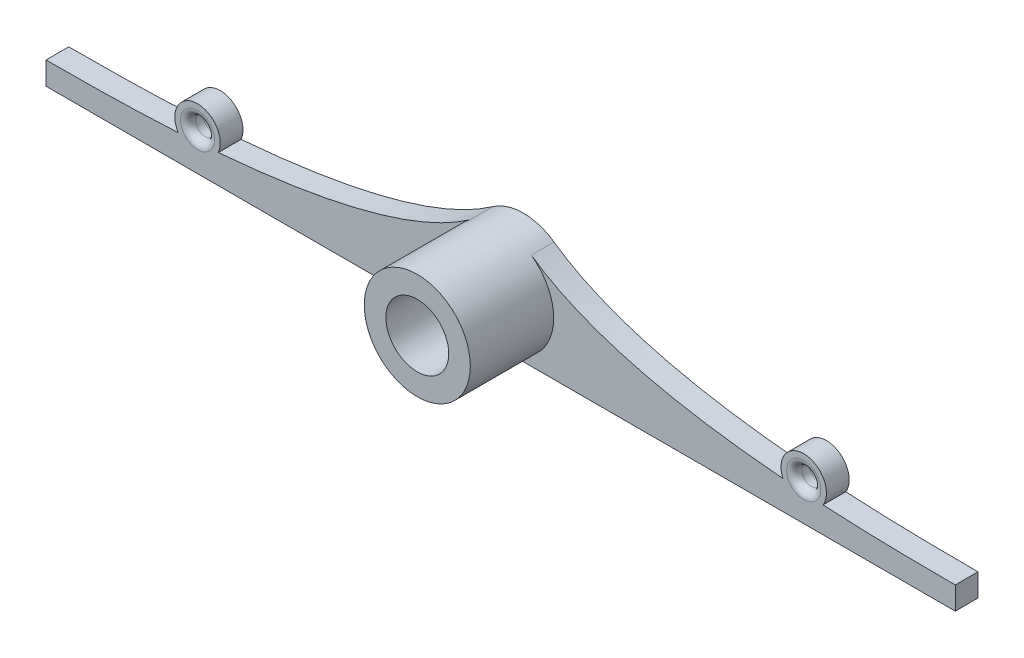
ISO-10303-21;
HEADER;
FILE_DESCRIPTION(('STEP AP214'),'2;1');
FILE_NAME('part.step','',(''),(''),'','','');
FILE_SCHEMA(('AUTOMOTIVE_DESIGN { 1 0 10303 214 1 1 1 1 }'));
ENDSEC;
DATA;
#1=APPLICATION_CONTEXT('core data for automotive mechanical design processes');
#2=APPLICATION_PROTOCOL_DEFINITION('international standard','automotive_design',2000,#1);
#3=PRODUCT_CONTEXT('',#1,'mechanical');
#4=PRODUCT('Part','Part','',(#3));
#5=PRODUCT_RELATED_PRODUCT_CATEGORY('part','',(#4));
#6=PRODUCT_DEFINITION_FORMATION('','',#4);
#7=PRODUCT_DEFINITION_CONTEXT('part definition',#1,'design');
#8=PRODUCT_DEFINITION('design','',#6,#7);
#9=PRODUCT_DEFINITION_SHAPE('','',#8);
#10=(LENGTH_UNIT() NAMED_UNIT(*) SI_UNIT(.MILLI.,.METRE.));
#11=(NAMED_UNIT(*) PLANE_ANGLE_UNIT() SI_UNIT($,.RADIAN.));
#12=(NAMED_UNIT(*) SI_UNIT($,.STERADIAN.) SOLID_ANGLE_UNIT());
#13=UNCERTAINTY_MEASURE_WITH_UNIT(LENGTH_MEASURE(1.E-05),#10,'distance_accuracy_value','');
#14=(GEOMETRIC_REPRESENTATION_CONTEXT(3) GLOBAL_UNCERTAINTY_ASSIGNED_CONTEXT((#13)) GLOBAL_UNIT_ASSIGNED_CONTEXT((#10,
#11,#12)) REPRESENTATION_CONTEXT('',''));
#15=CARTESIAN_POINT('',(0.,0.,0.));
#16=DIRECTION('',(0.,0.,1.));
#17=DIRECTION('',(1.,0.,0.));
#18=AXIS2_PLACEMENT_3D('',#15,#16,#17);
#19=CARTESIAN_POINT('',(-60.,-4.,3.));
#20=CARTESIAN_POINT('',(-44.8110230062299,-4.,3.));
#21=CARTESIAN_POINT('',(-17.0644180254731,-3.48359706406098,3.));
#22=CARTESIAN_POINT('',(-4.03865522459029,5.71745257758117,3.));
#23=B_SPLINE_CURVE_WITH_KNOTS('',3,(#19,#20,#21,#22),.UNSPECIFIED.,.F.,.F.,(4,4),(0.,1.),.UNSPECIFIED.);
#24=DIRECTION('',(0.,0.,-1.));
#25=VECTOR('',#24,1.);
#26=SURFACE_OF_LINEAR_EXTRUSION('',#23,#25);
#27=CARTESIAN_POINT('',(-60.,-4.,0.));
#28=CARTESIAN_POINT('',(-44.8110230062299,-4.,0.));
#29=CARTESIAN_POINT('',(-17.0644180254731,-3.48359706406098,0.));
#30=CARTESIAN_POINT('',(-4.03865522459029,5.71745257758117,0.));
#31=B_SPLINE_CURVE_WITH_KNOTS('',3,(#27,#28,#29,#30),.UNSPECIFIED.,.F.,.F.,(4,4),(0.,1.),.UNSPECIFIED.);
#32=CARTESIAN_POINT('',(-37.2547066708696,-3.20969605150733,0.));
#33=VERTEX_POINT('',#32);
#34=CARTESIAN_POINT('',(-4.03865522459029,5.71745257758117,0.));
#35=VERTEX_POINT('',#34);
#36=EDGE_CURVE('E238',#33,#35,#31,.T.);
#37=ORIENTED_EDGE('',*,*,#36,.F.);
#38=DIRECTION('',(0.,0.,-1.));
#39=VECTOR('',#38,1.);
#40=CARTESIAN_POINT('',(-37.2547066708696,-3.20969605150733,3.));
#41=LINE('',#40,#39);
#42=CARTESIAN_POINT('',(-37.2547066708696,-3.20969605150733,3.));
#43=VERTEX_POINT('',#42);
#44=EDGE_CURVE('E153',#43,#33,#41,.T.);
#45=ORIENTED_EDGE('',*,*,#44,.F.);
#46=CARTESIAN_POINT('',(-4.03865522459029,5.71745257758117,3.));
#47=VERTEX_POINT('',#46);
#48=EDGE_CURVE('E242',#43,#47,#23,.T.);
#49=ORIENTED_EDGE('',*,*,#48,.T.);
#50=DIRECTION('',(0.,0.,-1.));
#51=VECTOR('',#50,1.);
#52=CARTESIAN_POINT('',(-4.03865522459029,5.71745257758117,3.));
#53=LINE('',#52,#51);
#54=EDGE_CURVE('E342',#47,#35,#53,.T.);
#55=ORIENTED_EDGE('',*,*,#54,.T.);
#56=EDGE_LOOP('',(#37,#45,#49,#55));
#57=FACE_BOUND('',#56,.T.);
#58=ADVANCED_FACE('F102',(#57),#26,.T.);
#59=CARTESIAN_POINT('',(-40.,-2.,3.));
#60=DIRECTION('',(0.,0.,-1.));
#61=DIRECTION('',(-1.,0.,0.));
#62=AXIS2_PLACEMENT_3D('',#59,#60,#61);
#63=CYLINDRICAL_SURFACE('',#62,3.);
#64=CARTESIAN_POINT('',(-40.,-2.,0.));
#65=DIRECTION('',(0.,0.,1.));
#66=DIRECTION('',(1.,0.,0.));
#67=AXIS2_PLACEMENT_3D('',#64,#65,#66);
#68=CIRCLE('',#67,3.);
#69=CARTESIAN_POINT('',(-42.550732883701,-3.57916489196225,0.));
#70=VERTEX_POINT('',#69);
#71=EDGE_CURVE('E348',#33,#70,#68,.T.);
#72=ORIENTED_EDGE('',*,*,#71,.T.);
#73=DIRECTION('',(0.,0.,-1.));
#74=VECTOR('',#73,1.);
#75=CARTESIAN_POINT('',(-42.550732883701,-3.57916489196225,3.));
#76=LINE('',#75,#74);
#77=CARTESIAN_POINT('',(-42.550732883701,-3.57916489196225,3.));
#78=VERTEX_POINT('',#77);
#79=EDGE_CURVE('E379',#78,#70,#76,.T.);
#80=ORIENTED_EDGE('',*,*,#79,.F.);
#81=CARTESIAN_POINT('',(-40.,-2.,3.));
#82=DIRECTION('',(0.,0.,1.));
#83=DIRECTION('',(1.,0.,0.));
#84=AXIS2_PLACEMENT_3D('',#81,#82,#83);
#85=CIRCLE('',#84,3.);
#86=EDGE_CURVE('E248',#43,#78,#85,.T.);
#87=ORIENTED_EDGE('',*,*,#86,.F.);
#88=ORIENTED_EDGE('',*,*,#44,.T.);
#89=EDGE_LOOP('',(#72,#80,#87,#88));
#90=FACE_BOUND('',#89,.T.);
#91=ADVANCED_FACE('F258',(#90),#63,.T.);
#92=CARTESIAN_POINT('',(-60.,-4.,3.));
#93=CARTESIAN_POINT('',(-44.8110230062299,-4.,3.));
#94=CARTESIAN_POINT('',(-17.0644180254731,-3.48359706406098,3.));
#95=CARTESIAN_POINT('',(-4.03865522459029,5.71745257758117,3.));
#96=B_SPLINE_CURVE_WITH_KNOTS('',3,(#92,#93,#94,#95),.UNSPECIFIED.,.F.,.F.,(4,4),(0.,1.),.UNSPECIFIED.);
#97=DIRECTION('',(0.,0.,-1.));
#98=VECTOR('',#97,1.);
#99=SURFACE_OF_LINEAR_EXTRUSION('',#96,#98);
#100=CARTESIAN_POINT('',(-60.,-4.,0.));
#101=CARTESIAN_POINT('',(-44.8110230062299,-4.,0.));
#102=CARTESIAN_POINT('',(-17.0644180254731,-3.48359706406098,0.));
#103=CARTESIAN_POINT('',(-4.03865522459029,5.71745257758117,0.));
#104=B_SPLINE_CURVE_WITH_KNOTS('',3,(#100,#101,#102,#103),.UNSPECIFIED.,.F.,.F.,(4,4),(0.,1.),.UNSPECIFIED.);
#105=CARTESIAN_POINT('',(-60.,-4.,0.));
#106=VERTEX_POINT('',#105);
#107=EDGE_CURVE('E355',#106,#70,#104,.T.);
#108=ORIENTED_EDGE('',*,*,#107,.F.);
#109=DIRECTION('',(0.,0.,-1.));
#110=VECTOR('',#109,1.);
#111=CARTESIAN_POINT('',(-60.,-4.,3.));
#112=LINE('',#111,#110);
#113=CARTESIAN_POINT('',(-60.,-4.,3.));
#114=VERTEX_POINT('',#113);
#115=EDGE_CURVE('E376',#114,#106,#112,.T.);
#116=ORIENTED_EDGE('',*,*,#115,.F.);
#117=EDGE_CURVE('E323',#114,#78,#96,.T.);
#118=ORIENTED_EDGE('',*,*,#117,.T.);
#119=ORIENTED_EDGE('',*,*,#79,.T.);
#120=EDGE_LOOP('',(#108,#116,#118,#119));
#121=FACE_BOUND('',#120,.T.);
#122=ADVANCED_FACE('F320',(#121),#99,.T.);
#123=CARTESIAN_POINT('',(-60.,0.,3.));
#124=DIRECTION('',(-1.,0.,0.));
#125=DIRECTION('',(0.,0.,1.));
#126=AXIS2_PLACEMENT_3D('',#123,#124,#125);
#127=PLANE('',#126);
#128=DIRECTION('',(0.,1.,0.));
#129=VECTOR('',#128,1.);
#130=CARTESIAN_POINT('',(-60.,0.,0.));
#131=LINE('',#130,#129);
#132=CARTESIAN_POINT('',(-60.,-7.,0.));
#133=VERTEX_POINT('',#132);
#134=EDGE_CURVE('E361',#133,#106,#131,.T.);
#135=ORIENTED_EDGE('',*,*,#134,.F.);
#136=DIRECTION('',(0.,0.,-1.));
#137=VECTOR('',#136,1.);
#138=CARTESIAN_POINT('',(-60.,-7.,3.));
#139=LINE('',#138,#137);
#140=CARTESIAN_POINT('',(-60.,-7.,3.));
#141=VERTEX_POINT('',#140);
#142=EDGE_CURVE('E127',#141,#133,#139,.T.);
#143=ORIENTED_EDGE('',*,*,#142,.F.);
#144=DIRECTION('',(0.,1.,0.));
#145=VECTOR('',#144,1.);
#146=CARTESIAN_POINT('',(-60.,0.,3.));
#147=LINE('',#146,#145);
#148=EDGE_CURVE('E330',#141,#114,#147,.T.);
#149=ORIENTED_EDGE('',*,*,#148,.T.);
#150=ORIENTED_EDGE('',*,*,#115,.T.);
#151=EDGE_LOOP('',(#135,#143,#149,#150));
#152=FACE_BOUND('',#151,.T.);
#153=ADVANCED_FACE('F315',(#152),#127,.T.);
#154=CARTESIAN_POINT('',(0.,-7.,3.));
#155=DIRECTION('',(0.,-1.,0.));
#156=DIRECTION('',(0.,0.,-1.));
#157=AXIS2_PLACEMENT_3D('',#154,#155,#156);
#158=PLANE('',#157);
#159=DIRECTION('',(-1.,0.,0.));
#160=VECTOR('',#159,1.);
#161=CARTESIAN_POINT('',(0.,-7.,0.));
#162=LINE('',#161,#160);
#163=CARTESIAN_POINT('',(60.,-7.,0.));
#164=VERTEX_POINT('',#163);
#165=EDGE_CURVE('E249',#164,#133,#162,.T.);
#166=ORIENTED_EDGE('',*,*,#165,.F.);
#167=DIRECTION('',(0.,0.,-1.));
#168=VECTOR('',#167,1.);
#169=CARTESIAN_POINT('',(60.,-7.,3.));
#170=LINE('',#169,#168);
#171=CARTESIAN_POINT('',(60.,-7.,3.));
#172=VERTEX_POINT('',#171);
#173=EDGE_CURVE('E643',#172,#164,#170,.T.);
#174=ORIENTED_EDGE('',*,*,#173,.F.);
#175=DIRECTION('',(-1.,0.,0.));
#176=VECTOR('',#175,1.);
#177=CARTESIAN_POINT('',(0.,-7.,3.));
#178=LINE('',#177,#176);
#179=CARTESIAN_POINT('',(0.,-7.,3.));
#180=VERTEX_POINT('',#179);
#181=EDGE_CURVE('E673',#172,#180,#178,.T.);
#182=ORIENTED_EDGE('',*,*,#181,.T.);
#183=DIRECTION('',(-1.,0.,0.));
#184=VECTOR('',#183,1.);
#185=CARTESIAN_POINT('',(0.,-7.,3.));
#186=LINE('',#185,#184);
#187=EDGE_CURVE('E336',#180,#141,#186,.T.);
#188=ORIENTED_EDGE('',*,*,#187,.T.);
#189=ORIENTED_EDGE('',*,*,#142,.T.);
#190=EDGE_LOOP('',(#166,#174,#182,#188,#189));
#191=FACE_BOUND('',#190,.T.);
#192=ADVANCED_FACE('F303',(#191),#158,.T.);
#193=CARTESIAN_POINT('',(-40.,-2.,3.));
#194=DIRECTION('',(0.,0.,-1.));
#195=DIRECTION('',(-1.,0.,0.));
#196=AXIS2_PLACEMENT_3D('',#193,#194,#195);
#197=CYLINDRICAL_SURFACE('',#196,1.25);
#198=CARTESIAN_POINT('',(-40.,-2.,1.));
#199=DIRECTION('',(0.,0.,1.));
#200=DIRECTION('',(1.,0.,0.));
#201=AXIS2_PLACEMENT_3D('',#198,#199,#200);
#202=CIRCLE('',#201,1.25);
#203=CARTESIAN_POINT('',(-38.75,-2.,1.));
#204=VERTEX_POINT('',#203);
#205=EDGE_CURVE('E111',#204,#204,#202,.F.);
#206=ORIENTED_EDGE('',*,*,#205,.T.);
#207=EDGE_LOOP('',(#206));
#208=FACE_BOUND('',#207,.T.);
#209=CARTESIAN_POINT('',(-40.,-2.,2.));
#210=DIRECTION('',(0.,0.,1.));
#211=DIRECTION('',(1.,0.,0.));
#212=AXIS2_PLACEMENT_3D('',#209,#210,#211);
#213=CIRCLE('',#212,1.25);
#214=CARTESIAN_POINT('',(-38.75,-2.,2.));
#215=VERTEX_POINT('',#214);
#216=EDGE_CURVE('E288',#215,#215,#213,.T.);
#217=ORIENTED_EDGE('',*,*,#216,.T.);
#218=EDGE_LOOP('',(#217));
#219=FACE_BOUND('',#218,.T.);
#220=ADVANCED_FACE('F299',(#208,#219),#197,.F.);
#221=CARTESIAN_POINT('',(0.,0.,3.));
#222=DIRECTION('',(0.,0.,1.));
#223=DIRECTION('',(1.,0.,0.));
#224=AXIS2_PLACEMENT_3D('',#221,#222,#223);
#225=PLANE('',#224);
#226=CARTESIAN_POINT('',(-40.,-2.,3.));
#227=DIRECTION('',(0.,0.,1.));
#228=DIRECTION('',(1.,0.,0.));
#229=AXIS2_PLACEMENT_3D('',#226,#227,#228);
#230=CIRCLE('',#229,2.25);
#231=CARTESIAN_POINT('',(-37.75,-2.,3.));
#232=VERTEX_POINT('',#231);
#233=EDGE_CURVE('E12',#232,#232,#230,.F.);
#234=ORIENTED_EDGE('',*,*,#233,.T.);
#235=EDGE_LOOP('',(#234));
#236=FACE_BOUND('',#235,.T.);
#237=ORIENTED_EDGE('',*,*,#48,.F.);
#238=ORIENTED_EDGE('',*,*,#86,.T.);
#239=ORIENTED_EDGE('',*,*,#117,.F.);
#240=ORIENTED_EDGE('',*,*,#148,.F.);
#241=ORIENTED_EDGE('',*,*,#187,.F.);
#242=CARTESIAN_POINT('',(0.,0.,3.));
#243=DIRECTION('',(0.,0.,1.));
#244=DIRECTION('',(1.,0.,0.));
#245=AXIS2_PLACEMENT_3D('',#242,#243,#244);
#246=CIRCLE('',#245,7.);
#247=EDGE_CURVE('E339',#47,#180,#246,.T.);
#248=ORIENTED_EDGE('',*,*,#247,.F.);
#249=EDGE_LOOP('',(#237,#238,#239,#240,#241,#248));
#250=FACE_BOUND('',#249,.T.);
#251=ADVANCED_FACE('F302',(#236,#250),#225,.T.);
#252=CARTESIAN_POINT('',(0.,0.,0.));
#253=DIRECTION('',(0.,0.,1.));
#254=DIRECTION('',(1.,0.,0.));
#255=AXIS2_PLACEMENT_3D('',#252,#253,#254);
#256=PLANE('',#255);
#257=CARTESIAN_POINT('',(40.,-2.,0.));
#258=DIRECTION('',(0.,0.,1.));
#259=DIRECTION('',(1.,0.,0.));
#260=AXIS2_PLACEMENT_3D('',#257,#258,#259);
#261=CIRCLE('',#260,2.25);
#262=CARTESIAN_POINT('',(42.25,-2.,0.));
#263=VERTEX_POINT('',#262);
#264=EDGE_CURVE('E282',#263,#263,#261,.T.);
#265=ORIENTED_EDGE('',*,*,#264,.T.);
#266=EDGE_LOOP('',(#265));
#267=FACE_BOUND('',#266,.T.);
#268=CARTESIAN_POINT('',(-40.,-2.,0.));
#269=DIRECTION('',(0.,0.,1.));
#270=DIRECTION('',(1.,0.,0.));
#271=AXIS2_PLACEMENT_3D('',#268,#269,#270);
#272=CIRCLE('',#271,2.25);
#273=CARTESIAN_POINT('',(-37.75,-2.,0.));
#274=VERTEX_POINT('',#273);
#275=EDGE_CURVE('E279',#274,#274,#272,.T.);
#276=ORIENTED_EDGE('',*,*,#275,.T.);
#277=EDGE_LOOP('',(#276));
#278=FACE_BOUND('',#277,.T.);
#279=ORIENTED_EDGE('',*,*,#36,.T.);
#280=CARTESIAN_POINT('',(0.,0.,0.));
#281=DIRECTION('',(0.,0.,1.));
#282=DIRECTION('',(1.,0.,0.));
#283=AXIS2_PLACEMENT_3D('',#280,#281,#282);
#284=CIRCLE('',#283,7.);
#285=CARTESIAN_POINT('',(4.0386552292383,5.71745257429794,0.));
#286=VERTEX_POINT('',#285);
#287=EDGE_CURVE('E225',#286,#35,#284,.T.);
#288=ORIENTED_EDGE('',*,*,#287,.F.);
#289=CARTESIAN_POINT('',(60.,-4.,0.));
#290=CARTESIAN_POINT('',(44.8110225088808,-4.,0.));
#291=CARTESIAN_POINT('',(17.0644179568864,-3.48359703148616,0.));
#292=CARTESIAN_POINT('',(4.0386552292383,5.71745257429794,0.));
#293=B_SPLINE_CURVE_WITH_KNOTS('',3,(#289,#290,#291,#292),.UNSPECIFIED.,.F.,.F.,(4,4),(0.,1.),.UNSPECIFIED.);
#294=CARTESIAN_POINT('',(37.2547066755823,-3.20969606220236,0.));
#295=VERTEX_POINT('',#294);
#296=EDGE_CURVE('E653',#295,#286,#293,.T.);
#297=ORIENTED_EDGE('',*,*,#296,.F.);
#298=CARTESIAN_POINT('',(40.,-2.,0.));
#299=DIRECTION('',(0.,0.,1.));
#300=DIRECTION('',(1.,0.,0.));
#301=AXIS2_PLACEMENT_3D('',#298,#299,#300);
#302=CIRCLE('',#301,3.);
#303=CARTESIAN_POINT('',(42.5507328797199,-3.57916489839269,0.));
#304=VERTEX_POINT('',#303);
#305=EDGE_CURVE('E659',#304,#295,#302,.T.);
#306=ORIENTED_EDGE('',*,*,#305,.F.);
#307=CARTESIAN_POINT('',(60.,-4.,0.));
#308=CARTESIAN_POINT('',(44.8110225088808,-4.,0.));
#309=CARTESIAN_POINT('',(17.0644179568864,-3.48359703148616,0.));
#310=CARTESIAN_POINT('',(4.0386552292383,5.71745257429794,0.));
#311=B_SPLINE_CURVE_WITH_KNOTS('',3,(#307,#308,#309,#310),.UNSPECIFIED.,.F.,.F.,(4,4),(0.,1.),.UNSPECIFIED.);
#312=CARTESIAN_POINT('',(60.,-4.,0.));
#313=VERTEX_POINT('',#312);
#314=EDGE_CURVE('E218',#313,#304,#311,.T.);
#315=ORIENTED_EDGE('',*,*,#314,.F.);
#316=DIRECTION('',(0.,-1.,0.));
#317=VECTOR('',#316,1.);
#318=CARTESIAN_POINT('',(60.,0.,0.));
#319=LINE('',#318,#317);
#320=EDGE_CURVE('E214',#313,#164,#319,.T.);
#321=ORIENTED_EDGE('',*,*,#320,.T.);
#322=ORIENTED_EDGE('',*,*,#165,.T.);
#323=ORIENTED_EDGE('',*,*,#134,.T.);
#324=ORIENTED_EDGE('',*,*,#107,.T.);
#325=ORIENTED_EDGE('',*,*,#71,.F.);
#326=EDGE_LOOP('',(#279,#288,#297,#306,#315,#321,#322,#323,#324,#325));
#327=FACE_BOUND('',#326,.T.);
#328=CARTESIAN_POINT('',(0.,0.,0.));
#329=DIRECTION('',(0.,0.,1.));
#330=DIRECTION('',(1.,0.,0.));
#331=AXIS2_PLACEMENT_3D('',#328,#329,#330);
#332=CIRCLE('',#331,4.15);
#333=CARTESIAN_POINT('',(4.15,0.,0.));
#334=VERTEX_POINT('',#333);
#335=EDGE_CURVE('E220',#334,#334,#332,.T.);
#336=ORIENTED_EDGE('',*,*,#335,.T.);
#337=EDGE_LOOP('',(#336));
#338=FACE_BOUND('',#337,.T.);
#339=ADVANCED_FACE('F311',(#267,#278,#327,#338),#256,.F.);
#340=CARTESIAN_POINT('',(0.,0.,14.));
#341=DIRECTION('',(0.,0.,-1.));
#342=DIRECTION('',(-1.,0.,0.));
#343=AXIS2_PLACEMENT_3D('',#340,#341,#342);
#344=CYLINDRICAL_SURFACE('',#343,4.15);
#345=CARTESIAN_POINT('',(0.,0.,14.));
#346=DIRECTION('',(0.,0.,1.));
#347=DIRECTION('',(1.,0.,0.));
#348=AXIS2_PLACEMENT_3D('',#345,#346,#347);
#349=CIRCLE('',#348,4.15);
#350=CARTESIAN_POINT('',(4.15,0.,14.));
#351=VERTEX_POINT('',#350);
#352=EDGE_CURVE('E231',#351,#351,#349,.T.);
#353=ORIENTED_EDGE('',*,*,#352,.T.);
#354=EDGE_LOOP('',(#353));
#355=FACE_BOUND('',#354,.T.);
#356=ORIENTED_EDGE('',*,*,#335,.F.);
#357=EDGE_LOOP('',(#356));
#358=FACE_BOUND('',#357,.T.);
#359=ADVANCED_FACE('F402',(#355,#358),#344,.F.);
#360=CARTESIAN_POINT('',(0.,0.,14.));
#361=DIRECTION('',(0.,0.,-1.));
#362=DIRECTION('',(-1.,0.,0.));
#363=AXIS2_PLACEMENT_3D('',#360,#361,#362);
#364=CYLINDRICAL_SURFACE('',#363,7.);
#365=CARTESIAN_POINT('',(0.,0.,3.));
#366=DIRECTION('',(0.,0.,1.));
#367=DIRECTION('',(1.,0.,0.));
#368=AXIS2_PLACEMENT_3D('',#365,#366,#367);
#369=CIRCLE('',#368,7.);
#370=CARTESIAN_POINT('',(4.0386552292383,5.71745257429794,3.));
#371=VERTEX_POINT('',#370);
#372=EDGE_CURVE('E118',#180,#371,#369,.T.);
#373=ORIENTED_EDGE('',*,*,#372,.T.);
#374=DIRECTION('',(0.,0.,-1.));
#375=VECTOR('',#374,1.);
#376=CARTESIAN_POINT('',(4.0386552292383,5.71745257429794,3.));
#377=LINE('',#376,#375);
#378=EDGE_CURVE('E227',#371,#286,#377,.T.);
#379=ORIENTED_EDGE('',*,*,#378,.T.);
#380=ORIENTED_EDGE('',*,*,#287,.T.);
#381=ORIENTED_EDGE('',*,*,#54,.F.);
#382=ORIENTED_EDGE('',*,*,#247,.T.);
#383=EDGE_LOOP('',(#373,#379,#380,#381,#382));
#384=FACE_BOUND('',#383,.T.);
#385=CARTESIAN_POINT('',(0.,0.,14.));
#386=DIRECTION('',(0.,0.,1.));
#387=DIRECTION('',(1.,0.,0.));
#388=AXIS2_PLACEMENT_3D('',#385,#386,#387);
#389=CIRCLE('',#388,7.);
#390=CARTESIAN_POINT('',(7.,0.,14.));
#391=VERTEX_POINT('',#390);
#392=EDGE_CURVE('E235',#391,#391,#389,.T.);
#393=ORIENTED_EDGE('',*,*,#392,.F.);
#394=EDGE_LOOP('',(#393));
#395=FACE_BOUND('',#394,.T.);
#396=ADVANCED_FACE('F409',(#384,#395),#364,.T.);
#397=CARTESIAN_POINT('',(0.,0.,14.));
#398=DIRECTION('',(0.,0.,1.));
#399=DIRECTION('',(1.,0.,0.));
#400=AXIS2_PLACEMENT_3D('',#397,#398,#399);
#401=PLANE('',#400);
#402=ORIENTED_EDGE('',*,*,#352,.F.);
#403=EDGE_LOOP('',(#402));
#404=FACE_BOUND('',#403,.T.);
#405=ORIENTED_EDGE('',*,*,#392,.T.);
#406=EDGE_LOOP('',(#405));
#407=FACE_BOUND('',#406,.T.);
#408=ADVANCED_FACE('F415',(#404,#407),#401,.T.);
#409=CARTESIAN_POINT('',(60.,-4.,3.));
#410=CARTESIAN_POINT('',(44.8110225088808,-4.,3.));
#411=CARTESIAN_POINT('',(17.0644179568864,-3.48359703148616,3.));
#412=CARTESIAN_POINT('',(4.0386552292383,5.71745257429794,3.));
#413=B_SPLINE_CURVE_WITH_KNOTS('',3,(#409,#410,#411,#412),.UNSPECIFIED.,.F.,.F.,(4,4),(0.,1.),.UNSPECIFIED.);
#414=DIRECTION('',(0.,0.,-1.));
#415=VECTOR('',#414,1.);
#416=SURFACE_OF_LINEAR_EXTRUSION('',#413,#415);
#417=ORIENTED_EDGE('',*,*,#314,.T.);
#418=DIRECTION('',(0.,0.,-1.));
#419=VECTOR('',#418,1.);
#420=CARTESIAN_POINT('',(42.5507328797199,-3.57916489839269,3.));
#421=LINE('',#420,#419);
#422=CARTESIAN_POINT('',(42.5507328797199,-3.57916489839269,3.));
#423=VERTEX_POINT('',#422);
#424=EDGE_CURVE('E196',#423,#304,#421,.T.);
#425=ORIENTED_EDGE('',*,*,#424,.F.);
#426=CARTESIAN_POINT('',(60.,-4.,3.));
#427=VERTEX_POINT('',#426);
#428=EDGE_CURVE('E204',#427,#423,#413,.T.);
#429=ORIENTED_EDGE('',*,*,#428,.F.);
#430=DIRECTION('',(0.,0.,-1.));
#431=VECTOR('',#430,1.);
#432=CARTESIAN_POINT('',(60.,-4.,3.));
#433=LINE('',#432,#431);
#434=EDGE_CURVE('E645',#427,#313,#433,.T.);
#435=ORIENTED_EDGE('',*,*,#434,.T.);
#436=EDGE_LOOP('',(#417,#425,#429,#435));
#437=FACE_BOUND('',#436,.T.);
#438=ADVANCED_FACE('F216',(#437),#416,.F.);
#439=CARTESIAN_POINT('',(40.,-2.,3.));
#440=DIRECTION('',(0.,0.,-1.));
#441=DIRECTION('',(-1.,0.,0.));
#442=AXIS2_PLACEMENT_3D('',#439,#440,#441);
#443=CYLINDRICAL_SURFACE('',#442,3.);
#444=ORIENTED_EDGE('',*,*,#305,.T.);
#445=DIRECTION('',(0.,0.,-1.));
#446=VECTOR('',#445,1.);
#447=CARTESIAN_POINT('',(37.2547066755823,-3.20969606220236,3.));
#448=LINE('',#447,#446);
#449=CARTESIAN_POINT('',(37.2547066755823,-3.20969606220236,3.));
#450=VERTEX_POINT('',#449);
#451=EDGE_CURVE('E199',#450,#295,#448,.T.);
#452=ORIENTED_EDGE('',*,*,#451,.F.);
#453=CARTESIAN_POINT('',(40.,-2.,3.));
#454=DIRECTION('',(0.,0.,1.));
#455=DIRECTION('',(1.,0.,0.));
#456=AXIS2_PLACEMENT_3D('',#453,#454,#455);
#457=CIRCLE('',#456,3.);
#458=EDGE_CURVE('E192',#423,#450,#457,.T.);
#459=ORIENTED_EDGE('',*,*,#458,.F.);
#460=ORIENTED_EDGE('',*,*,#424,.T.);
#461=EDGE_LOOP('',(#444,#452,#459,#460));
#462=FACE_BOUND('',#461,.T.);
#463=ADVANCED_FACE('F194',(#462),#443,.T.);
#464=CARTESIAN_POINT('',(60.,-4.,3.));
#465=CARTESIAN_POINT('',(44.8110225088808,-4.,3.));
#466=CARTESIAN_POINT('',(17.0644179568864,-3.48359703148616,3.));
#467=CARTESIAN_POINT('',(4.0386552292383,5.71745257429794,3.));
#468=B_SPLINE_CURVE_WITH_KNOTS('',3,(#464,#465,#466,#467),.UNSPECIFIED.,.F.,.F.,(4,4),(0.,1.),.UNSPECIFIED.);
#469=DIRECTION('',(0.,0.,-1.));
#470=VECTOR('',#469,1.);
#471=SURFACE_OF_LINEAR_EXTRUSION('',#468,#470);
#472=ORIENTED_EDGE('',*,*,#296,.T.);
#473=ORIENTED_EDGE('',*,*,#378,.F.);
#474=EDGE_CURVE('E203',#450,#371,#468,.T.);
#475=ORIENTED_EDGE('',*,*,#474,.F.);
#476=ORIENTED_EDGE('',*,*,#451,.T.);
#477=EDGE_LOOP('',(#472,#473,#475,#476));
#478=FACE_BOUND('',#477,.T.);
#479=ADVANCED_FACE('F440',(#478),#471,.F.);
#480=CARTESIAN_POINT('',(60.,0.,3.));
#481=DIRECTION('',(1.,0.,0.));
#482=DIRECTION('',(0.,0.,-1.));
#483=AXIS2_PLACEMENT_3D('',#480,#481,#482);
#484=PLANE('',#483);
#485=ORIENTED_EDGE('',*,*,#320,.F.);
#486=ORIENTED_EDGE('',*,*,#434,.F.);
#487=DIRECTION('',(0.,-1.,0.));
#488=VECTOR('',#487,1.);
#489=CARTESIAN_POINT('',(60.,0.,3.));
#490=LINE('',#489,#488);
#491=EDGE_CURVE('E211',#427,#172,#490,.T.);
#492=ORIENTED_EDGE('',*,*,#491,.T.);
#493=ORIENTED_EDGE('',*,*,#173,.T.);
#494=EDGE_LOOP('',(#485,#486,#492,#493));
#495=FACE_BOUND('',#494,.T.);
#496=ADVANCED_FACE('F395',(#495),#484,.T.);
#497=CARTESIAN_POINT('',(40.,-2.,3.));
#498=DIRECTION('',(0.,0.,-1.));
#499=DIRECTION('',(-1.,0.,0.));
#500=AXIS2_PLACEMENT_3D('',#497,#498,#499);
#501=CYLINDRICAL_SURFACE('',#500,1.25);
#502=CARTESIAN_POINT('',(40.,-2.,2.));
#503=DIRECTION('',(0.,0.,1.));
#504=DIRECTION('',(1.,0.,0.));
#505=AXIS2_PLACEMENT_3D('',#502,#503,#504);
#506=CIRCLE('',#505,1.25);
#507=CARTESIAN_POINT('',(41.25,-2.,2.));
#508=VERTEX_POINT('',#507);
#509=EDGE_CURVE('E291',#508,#508,#506,.T.);
#510=ORIENTED_EDGE('',*,*,#509,.T.);
#511=EDGE_LOOP('',(#510));
#512=FACE_BOUND('',#511,.T.);
#513=CARTESIAN_POINT('',(40.,-2.,1.));
#514=DIRECTION('',(0.,0.,1.));
#515=DIRECTION('',(1.,0.,0.));
#516=AXIS2_PLACEMENT_3D('',#513,#514,#515);
#517=CIRCLE('',#516,1.25);
#518=CARTESIAN_POINT('',(41.25,-2.,1.));
#519=VERTEX_POINT('',#518);
#520=EDGE_CURVE('E384',#519,#519,#517,.F.);
#521=ORIENTED_EDGE('',*,*,#520,.T.);
#522=EDGE_LOOP('',(#521));
#523=FACE_BOUND('',#522,.T.);
#524=ADVANCED_FACE('F391',(#512,#523),#501,.F.);
#525=CARTESIAN_POINT('',(0.,0.,3.));
#526=DIRECTION('',(0.,0.,1.));
#527=DIRECTION('',(1.,0.,0.));
#528=AXIS2_PLACEMENT_3D('',#525,#526,#527);
#529=PLANE('',#528);
#530=CARTESIAN_POINT('',(40.,-2.,3.));
#531=DIRECTION('',(0.,0.,1.));
#532=DIRECTION('',(1.,0.,0.));
#533=AXIS2_PLACEMENT_3D('',#530,#531,#532);
#534=CIRCLE('',#533,2.25);
#535=CARTESIAN_POINT('',(42.25,-2.,3.));
#536=VERTEX_POINT('',#535);
#537=EDGE_CURVE('E283',#536,#536,#534,.F.);
#538=ORIENTED_EDGE('',*,*,#537,.T.);
#539=EDGE_LOOP('',(#538));
#540=FACE_BOUND('',#539,.T.);
#541=ORIENTED_EDGE('',*,*,#428,.T.);
#542=ORIENTED_EDGE('',*,*,#458,.T.);
#543=ORIENTED_EDGE('',*,*,#474,.T.);
#544=ORIENTED_EDGE('',*,*,#372,.F.);
#545=ORIENTED_EDGE('',*,*,#181,.F.);
#546=ORIENTED_EDGE('',*,*,#491,.F.);
#547=EDGE_LOOP('',(#541,#542,#543,#544,#545,#546));
#548=FACE_BOUND('',#547,.T.);
#549=ADVANCED_FACE('F208',(#540,#548),#529,.T.);
#550=CARTESIAN_POINT('',(40.,-2.,2.));
#551=DIRECTION('',(0.,0.,1.));
#552=DIRECTION('',(1.,0.,0.));
#553=AXIS2_PLACEMENT_3D('',#550,#551,#552);
#554=TOROIDAL_SURFACE('',#553,2.25,1.);
#555=ORIENTED_EDGE('',*,*,#537,.F.);
#556=EDGE_LOOP('',(#555));
#557=FACE_BOUND('',#556,.T.);
#558=ORIENTED_EDGE('',*,*,#509,.F.);
#559=EDGE_LOOP('',(#558));
#560=FACE_BOUND('',#559,.T.);
#561=ADVANCED_FACE('F260',(#557,#560),#554,.T.);
#562=CARTESIAN_POINT('',(40.,-2.,1.));
#563=DIRECTION('',(0.,0.,1.));
#564=DIRECTION('',(1.,0.,0.));
#565=AXIS2_PLACEMENT_3D('',#562,#563,#564);
#566=TOROIDAL_SURFACE('',#565,2.25,1.);
#567=ORIENTED_EDGE('',*,*,#520,.F.);
#568=EDGE_LOOP('',(#567));
#569=FACE_BOUND('',#568,.T.);
#570=ORIENTED_EDGE('',*,*,#264,.F.);
#571=EDGE_LOOP('',(#570));
#572=FACE_BOUND('',#571,.T.);
#573=ADVANCED_FACE('F263',(#569,#572),#566,.T.);
#574=CARTESIAN_POINT('',(-40.,-2.,1.));
#575=DIRECTION('',(0.,0.,1.));
#576=DIRECTION('',(1.,0.,0.));
#577=AXIS2_PLACEMENT_3D('',#574,#575,#576);
#578=TOROIDAL_SURFACE('',#577,2.25,1.);
#579=ORIENTED_EDGE('',*,*,#205,.F.);
#580=EDGE_LOOP('',(#579));
#581=FACE_BOUND('',#580,.T.);
#582=ORIENTED_EDGE('',*,*,#275,.F.);
#583=EDGE_LOOP('',(#582));
#584=FACE_BOUND('',#583,.T.);
#585=ADVANCED_FACE('F266',(#581,#584),#578,.T.);
#586=CARTESIAN_POINT('',(-40.,-2.,2.));
#587=DIRECTION('',(0.,0.,1.));
#588=DIRECTION('',(1.,0.,0.));
#589=AXIS2_PLACEMENT_3D('',#586,#587,#588);
#590=TOROIDAL_SURFACE('',#589,2.25,1.);
#591=ORIENTED_EDGE('',*,*,#233,.F.);
#592=EDGE_LOOP('',(#591));
#593=FACE_BOUND('',#592,.T.);
#594=ORIENTED_EDGE('',*,*,#216,.F.);
#595=EDGE_LOOP('',(#594));
#596=FACE_BOUND('',#595,.T.);
#597=ADVANCED_FACE('F104',(#593,#596),#590,.T.);
#598=CLOSED_SHELL('',(#58,#91,#122,#153,#192,#220,#251,#339,#359,#396,#408,#438,#463,#479,#496,
#524,#549,#561,#573,#585,#597));
#599=MANIFOLD_SOLID_BREP('B2',#598);
#600=ADVANCED_BREP_SHAPE_REPRESENTATION('',(#18,#599),#14);
#601=SHAPE_DEFINITION_REPRESENTATION(#9,#600);
ENDSEC;
END-ISO-10303-21;
